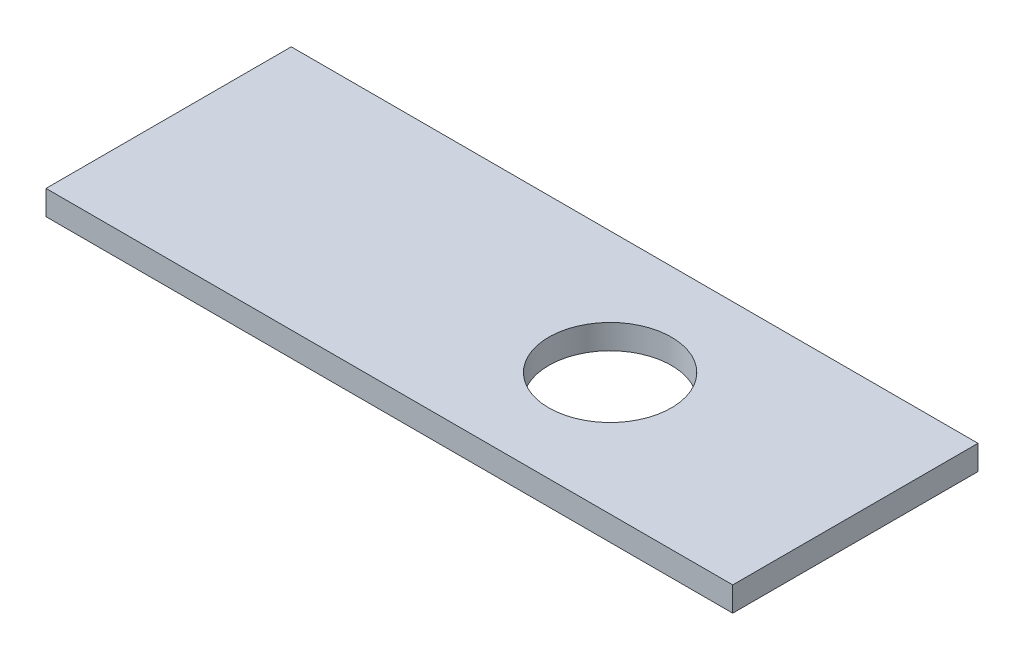
ISO-10303-21;
HEADER;
FILE_DESCRIPTION(('STEP AP214'),'2;1');
FILE_NAME('part.step','',(''),(''),'','','');
FILE_SCHEMA(('AUTOMOTIVE_DESIGN { 1 0 10303 214 1 1 1 1 }'));
ENDSEC;
DATA;
#1=APPLICATION_CONTEXT('core data for automotive mechanical design processes');
#2=APPLICATION_PROTOCOL_DEFINITION('international standard','automotive_design',2000,#1);
#3=PRODUCT_CONTEXT('',#1,'mechanical');
#4=PRODUCT('Part','Part','',(#3));
#5=PRODUCT_RELATED_PRODUCT_CATEGORY('part','',(#4));
#6=PRODUCT_DEFINITION_FORMATION('','',#4);
#7=PRODUCT_DEFINITION_CONTEXT('part definition',#1,'design');
#8=PRODUCT_DEFINITION('design','',#6,#7);
#9=PRODUCT_DEFINITION_SHAPE('','',#8);
#10=(LENGTH_UNIT() NAMED_UNIT(*) SI_UNIT(.MILLI.,.METRE.));
#11=(NAMED_UNIT(*) PLANE_ANGLE_UNIT() SI_UNIT($,.RADIAN.));
#12=(NAMED_UNIT(*) SI_UNIT($,.STERADIAN.) SOLID_ANGLE_UNIT());
#13=UNCERTAINTY_MEASURE_WITH_UNIT(LENGTH_MEASURE(1.E-05),#10,'distance_accuracy_value','');
#14=(GEOMETRIC_REPRESENTATION_CONTEXT(3) GLOBAL_UNCERTAINTY_ASSIGNED_CONTEXT((#13)) GLOBAL_UNIT_ASSIGNED_CONTEXT((#10,
#11,#12)) REPRESENTATION_CONTEXT('',''));
#15=CARTESIAN_POINT('',(0.,0.,0.));
#16=DIRECTION('',(0.,0.,1.));
#17=DIRECTION('',(1.,0.,0.));
#18=AXIS2_PLACEMENT_3D('',#15,#16,#17);
#19=CARTESIAN_POINT('',(0.,1.,0.));
#20=DIRECTION('',(0.,-1.,0.));
#21=DIRECTION('',(0.,0.,-1.));
#22=AXIS2_PLACEMENT_3D('',#19,#20,#21);
#23=PLANE('',#22);
#24=DIRECTION('',(0.,0.,1.));
#25=VECTOR('',#24,1.);
#26=CARTESIAN_POINT('',(-20.,1.,-5.));
#27=LINE('',#26,#25);
#28=CARTESIAN_POINT('',(-20.,1.,-5.));
#29=VERTEX_POINT('',#28);
#30=CARTESIAN_POINT('',(-20.,1.,5.));
#31=VERTEX_POINT('',#30);
#32=EDGE_CURVE('E92',#29,#31,#27,.T.);
#33=ORIENTED_EDGE('',*,*,#32,.T.);
#34=DIRECTION('',(1.,0.,0.));
#35=VECTOR('',#34,1.);
#36=CARTESIAN_POINT('',(8.,1.,5.));
#37=LINE('',#36,#35);
#38=CARTESIAN_POINT('',(8.,1.,5.));
#39=VERTEX_POINT('',#38);
#40=EDGE_CURVE('E87',#31,#39,#37,.T.);
#41=ORIENTED_EDGE('',*,*,#40,.T.);
#42=DIRECTION('',(0.,0.,-1.));
#43=VECTOR('',#42,1.);
#44=CARTESIAN_POINT('',(8.,1.,-5.));
#45=LINE('',#44,#43);
#46=CARTESIAN_POINT('',(8.,1.,-5.));
#47=VERTEX_POINT('',#46);
#48=EDGE_CURVE('E90',#39,#47,#45,.T.);
#49=ORIENTED_EDGE('',*,*,#48,.T.);
#50=DIRECTION('',(-1.,0.,0.));
#51=VECTOR('',#50,1.);
#52=CARTESIAN_POINT('',(8.,1.,-5.));
#53=LINE('',#52,#51);
#54=EDGE_CURVE('E57',#47,#29,#53,.T.);
#55=ORIENTED_EDGE('',*,*,#54,.T.);
#56=EDGE_LOOP('',(#33,#41,#49,#55));
#57=FACE_BOUND('',#56,.T.);
#58=CARTESIAN_POINT('',(-2.,1.,0.));
#59=DIRECTION('',(0.,1.,0.));
#60=DIRECTION('',(0.,0.,1.));
#61=AXIS2_PLACEMENT_3D('',#58,#59,#60);
#62=CIRCLE('',#61,2.5);
#63=CARTESIAN_POINT('',(-2.,1.,2.50000000000001));
#64=VERTEX_POINT('',#63);
#65=EDGE_CURVE('E112',#64,#64,#62,.T.);
#66=ORIENTED_EDGE('',*,*,#65,.F.);
#67=EDGE_LOOP('',(#66));
#68=FACE_BOUND('',#67,.T.);
#69=ADVANCED_FACE('F39',(#57,#68),#23,.F.);
#70=CARTESIAN_POINT('',(0.,0.,0.));
#71=DIRECTION('',(0.,-1.,0.));
#72=DIRECTION('',(0.,0.,-1.));
#73=AXIS2_PLACEMENT_3D('',#70,#71,#72);
#74=PLANE('',#73);
#75=DIRECTION('',(0.,0.,1.));
#76=VECTOR('',#75,1.);
#77=CARTESIAN_POINT('',(-20.,0.,-5.));
#78=LINE('',#77,#76);
#79=CARTESIAN_POINT('',(-20.,0.,-5.));
#80=VERTEX_POINT('',#79);
#81=CARTESIAN_POINT('',(-20.,0.,5.));
#82=VERTEX_POINT('',#81);
#83=EDGE_CURVE('E108',#80,#82,#78,.T.);
#84=ORIENTED_EDGE('',*,*,#83,.F.);
#85=DIRECTION('',(-1.,0.,0.));
#86=VECTOR('',#85,1.);
#87=CARTESIAN_POINT('',(8.,0.,-5.));
#88=LINE('',#87,#86);
#89=CARTESIAN_POINT('',(8.,0.,-5.));
#90=VERTEX_POINT('',#89);
#91=EDGE_CURVE('E80',#90,#80,#88,.T.);
#92=ORIENTED_EDGE('',*,*,#91,.F.);
#93=DIRECTION('',(0.,0.,-1.));
#94=VECTOR('',#93,1.);
#95=CARTESIAN_POINT('',(8.,0.,-5.));
#96=LINE('',#95,#94);
#97=CARTESIAN_POINT('',(8.,0.,5.));
#98=VERTEX_POINT('',#97);
#99=EDGE_CURVE('E74',#98,#90,#96,.T.);
#100=ORIENTED_EDGE('',*,*,#99,.F.);
#101=DIRECTION('',(1.,0.,0.));
#102=VECTOR('',#101,1.);
#103=CARTESIAN_POINT('',(8.,0.,5.));
#104=LINE('',#103,#102);
#105=EDGE_CURVE('E97',#82,#98,#104,.T.);
#106=ORIENTED_EDGE('',*,*,#105,.F.);
#107=EDGE_LOOP('',(#84,#92,#100,#106));
#108=FACE_BOUND('',#107,.T.);
#109=CARTESIAN_POINT('',(-2.,0.,0.));
#110=DIRECTION('',(0.,1.,0.));
#111=DIRECTION('',(0.,0.,1.));
#112=AXIS2_PLACEMENT_3D('',#109,#110,#111);
#113=CIRCLE('',#112,2.5);
#114=CARTESIAN_POINT('',(-2.,0.,2.50000000000001));
#115=VERTEX_POINT('',#114);
#116=EDGE_CURVE('E130',#115,#115,#113,.T.);
#117=ORIENTED_EDGE('',*,*,#116,.T.);
#118=EDGE_LOOP('',(#117));
#119=FACE_BOUND('',#118,.T.);
#120=ADVANCED_FACE('F125',(#108,#119),#74,.T.);
#121=CARTESIAN_POINT('',(-20.,1.,-5.));
#122=DIRECTION('',(1.,0.,0.));
#123=DIRECTION('',(0.,0.,-1.));
#124=AXIS2_PLACEMENT_3D('',#121,#122,#123);
#125=PLANE('',#124);
#126=ORIENTED_EDGE('',*,*,#83,.T.);
#127=DIRECTION('',(0.,-1.,0.));
#128=VECTOR('',#127,1.);
#129=CARTESIAN_POINT('',(-20.,1.,5.));
#130=LINE('',#129,#128);
#131=EDGE_CURVE('E11',#31,#82,#130,.T.);
#132=ORIENTED_EDGE('',*,*,#131,.F.);
#133=ORIENTED_EDGE('',*,*,#32,.F.);
#134=DIRECTION('',(0.,-1.,0.));
#135=VECTOR('',#134,1.);
#136=CARTESIAN_POINT('',(-20.,1.,-5.));
#137=LINE('',#136,#135);
#138=EDGE_CURVE('E104',#29,#80,#137,.T.);
#139=ORIENTED_EDGE('',*,*,#138,.T.);
#140=EDGE_LOOP('',(#126,#132,#133,#139));
#141=FACE_BOUND('',#140,.T.);
#142=ADVANCED_FACE('F41',(#141),#125,.F.);
#143=CARTESIAN_POINT('',(8.,1.,5.));
#144=DIRECTION('',(0.,0.,-1.));
#145=DIRECTION('',(-1.,0.,0.));
#146=AXIS2_PLACEMENT_3D('',#143,#144,#145);
#147=PLANE('',#146);
#148=ORIENTED_EDGE('',*,*,#105,.T.);
#149=DIRECTION('',(0.,-1.,0.));
#150=VECTOR('',#149,1.);
#151=CARTESIAN_POINT('',(8.,1.,5.));
#152=LINE('',#151,#150);
#153=EDGE_CURVE('E49',#39,#98,#152,.T.);
#154=ORIENTED_EDGE('',*,*,#153,.F.);
#155=ORIENTED_EDGE('',*,*,#40,.F.);
#156=ORIENTED_EDGE('',*,*,#131,.T.);
#157=EDGE_LOOP('',(#148,#154,#155,#156));
#158=FACE_BOUND('',#157,.T.);
#159=ADVANCED_FACE('F96',(#158),#147,.F.);
#160=CARTESIAN_POINT('',(8.,1.,-5.));
#161=DIRECTION('',(-1.,0.,0.));
#162=DIRECTION('',(0.,0.,1.));
#163=AXIS2_PLACEMENT_3D('',#160,#161,#162);
#164=PLANE('',#163);
#165=ORIENTED_EDGE('',*,*,#99,.T.);
#166=DIRECTION('',(0.,-1.,0.));
#167=VECTOR('',#166,1.);
#168=CARTESIAN_POINT('',(8.,1.,-5.));
#169=LINE('',#168,#167);
#170=EDGE_CURVE('E99',#47,#90,#169,.T.);
#171=ORIENTED_EDGE('',*,*,#170,.F.);
#172=ORIENTED_EDGE('',*,*,#48,.F.);
#173=ORIENTED_EDGE('',*,*,#153,.T.);
#174=EDGE_LOOP('',(#165,#171,#172,#173));
#175=FACE_BOUND('',#174,.T.);
#176=ADVANCED_FACE('F100',(#175),#164,.F.);
#177=CARTESIAN_POINT('',(8.,1.,-5.));
#178=DIRECTION('',(0.,0.,1.));
#179=DIRECTION('',(1.,0.,0.));
#180=AXIS2_PLACEMENT_3D('',#177,#178,#179);
#181=PLANE('',#180);
#182=ORIENTED_EDGE('',*,*,#91,.T.);
#183=ORIENTED_EDGE('',*,*,#138,.F.);
#184=ORIENTED_EDGE('',*,*,#54,.F.);
#185=ORIENTED_EDGE('',*,*,#170,.T.);
#186=EDGE_LOOP('',(#182,#183,#184,#185));
#187=FACE_BOUND('',#186,.T.);
#188=ADVANCED_FACE('F122',(#187),#181,.F.);
#189=CARTESIAN_POINT('',(-2.,1.,0.));
#190=DIRECTION('',(0.,-1.,0.));
#191=DIRECTION('',(0.,0.,-1.));
#192=AXIS2_PLACEMENT_3D('',#189,#190,#191);
#193=CYLINDRICAL_SURFACE('',#192,2.5);
#194=ORIENTED_EDGE('',*,*,#65,.T.);
#195=EDGE_LOOP('',(#194));
#196=FACE_BOUND('',#195,.T.);
#197=ORIENTED_EDGE('',*,*,#116,.F.);
#198=EDGE_LOOP('',(#197));
#199=FACE_BOUND('',#198,.T.);
#200=ADVANCED_FACE('F138',(#196,#199),#193,.F.);
#201=CLOSED_SHELL('',(#69,#120,#142,#159,#176,#188,#200));
#202=MANIFOLD_SOLID_BREP('B2',#201);
#203=ADVANCED_BREP_SHAPE_REPRESENTATION('',(#18,#202),#14);
#204=SHAPE_DEFINITION_REPRESENTATION(#9,#203);
ENDSEC;
END-ISO-10303-21;
